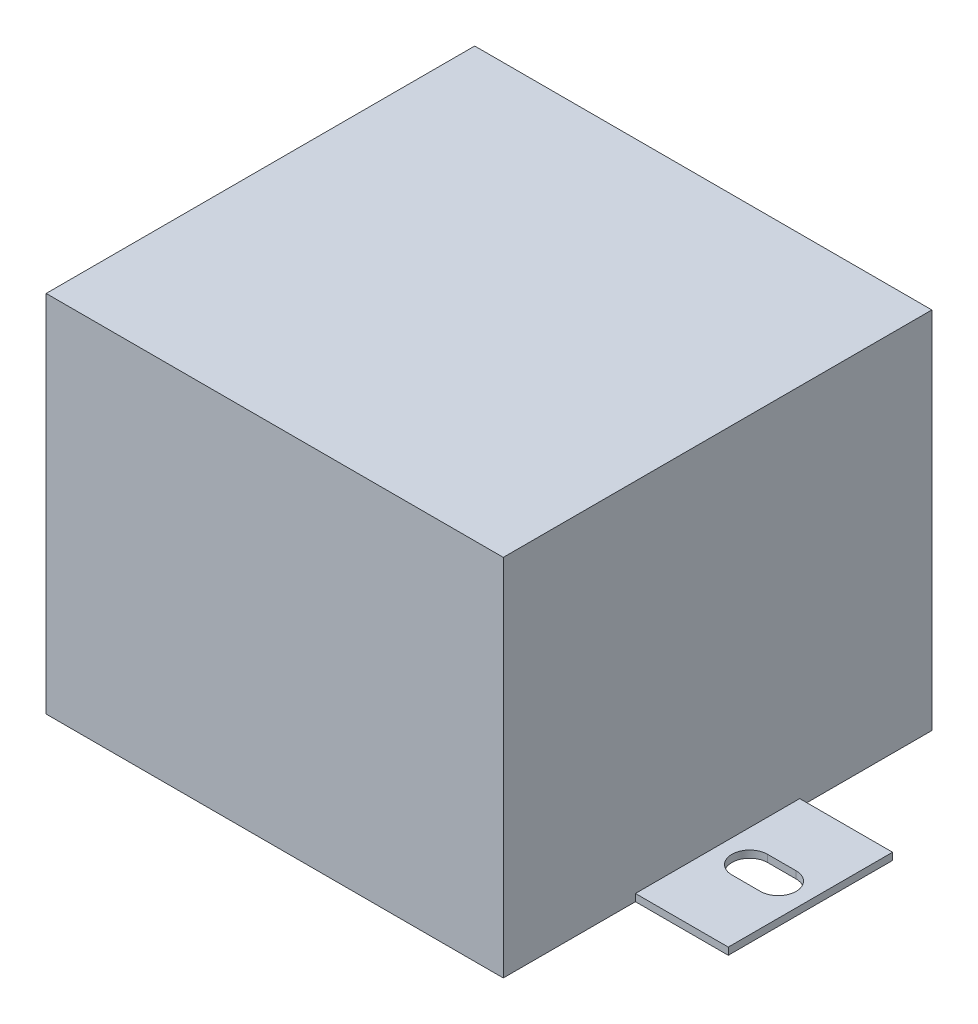
ISO-10303-21;
HEADER;
FILE_DESCRIPTION(('STEP AP214'),'2;1');
FILE_NAME('part.step','',(''),(''),'','','');
FILE_SCHEMA(('AUTOMOTIVE_DESIGN { 1 0 10303 214 1 1 1 1 }'));
ENDSEC;
DATA;
#1=APPLICATION_CONTEXT('core data for automotive mechanical design processes');
#2=APPLICATION_PROTOCOL_DEFINITION('international standard','automotive_design',2000,#1);
#3=PRODUCT_CONTEXT('',#1,'mechanical');
#4=PRODUCT('Part','Part','',(#3));
#5=PRODUCT_RELATED_PRODUCT_CATEGORY('part','',(#4));
#6=PRODUCT_DEFINITION_FORMATION('','',#4);
#7=PRODUCT_DEFINITION_CONTEXT('part definition',#1,'design');
#8=PRODUCT_DEFINITION('design','',#6,#7);
#9=PRODUCT_DEFINITION_SHAPE('','',#8);
#10=(LENGTH_UNIT() NAMED_UNIT(*) SI_UNIT(.MILLI.,.METRE.));
#11=(NAMED_UNIT(*) PLANE_ANGLE_UNIT() SI_UNIT($,.RADIAN.));
#12=(NAMED_UNIT(*) SI_UNIT($,.STERADIAN.) SOLID_ANGLE_UNIT());
#13=UNCERTAINTY_MEASURE_WITH_UNIT(LENGTH_MEASURE(1.E-05),#10,'distance_accuracy_value','');
#14=(GEOMETRIC_REPRESENTATION_CONTEXT(3) GLOBAL_UNCERTAINTY_ASSIGNED_CONTEXT((#13)) GLOBAL_UNIT_ASSIGNED_CONTEXT((#10,
#11,#12)) REPRESENTATION_CONTEXT('',''));
#15=CARTESIAN_POINT('',(0.,0.,0.));
#16=DIRECTION('',(0.,0.,1.));
#17=DIRECTION('',(1.,0.,0.));
#18=AXIS2_PLACEMENT_3D('',#15,#16,#17);
#19=CARTESIAN_POINT('',(0.,1.,0.));
#20=DIRECTION('',(0.,-1.,0.));
#21=DIRECTION('',(0.,0.,-1.));
#22=AXIS2_PLACEMENT_3D('',#19,#20,#21);
#23=PLANE('',#22);
#24=CARTESIAN_POINT('',(-36.5,1.,0.));
#25=DIRECTION('',(0.,1.,0.));
#26=DIRECTION('',(0.,0.,1.));
#27=AXIS2_PLACEMENT_3D('',#24,#25,#26);
#28=CIRCLE('',#27,2.5);
#29=CARTESIAN_POINT('',(-36.5,1.,2.5));
#30=VERTEX_POINT('',#29);
#31=CARTESIAN_POINT('',(-36.5,1.,-2.49999999999999));
#32=VERTEX_POINT('',#31);
#33=EDGE_CURVE('E258',#30,#32,#28,.T.);
#34=ORIENTED_EDGE('',*,*,#33,.F.);
#35=DIRECTION('',(1.,0.,0.));
#36=VECTOR('',#35,1.);
#37=CARTESIAN_POINT('',(-40.5,1.,2.5));
#38=LINE('',#37,#36);
#39=CARTESIAN_POINT('',(-40.5,1.,2.5));
#40=VERTEX_POINT('',#39);
#41=EDGE_CURVE('E269',#40,#30,#38,.T.);
#42=ORIENTED_EDGE('',*,*,#41,.F.);
#43=CARTESIAN_POINT('',(-40.5,1.,0.));
#44=DIRECTION('',(0.,1.,0.));
#45=DIRECTION('',(0.,0.,-1.));
#46=AXIS2_PLACEMENT_3D('',#43,#44,#45);
#47=CIRCLE('',#46,2.5);
#48=CARTESIAN_POINT('',(-40.5,1.,-2.49999999999999));
#49=VERTEX_POINT('',#48);
#50=EDGE_CURVE('E265',#49,#40,#47,.T.);
#51=ORIENTED_EDGE('',*,*,#50,.F.);
#52=DIRECTION('',(-1.,0.,0.));
#53=VECTOR('',#52,1.);
#54=CARTESIAN_POINT('',(-40.5,1.,-2.49999999999999));
#55=LINE('',#54,#53);
#56=EDGE_CURVE('E261',#32,#49,#55,.T.);
#57=ORIENTED_EDGE('',*,*,#56,.F.);
#58=EDGE_LOOP('',(#34,#42,#51,#57));
#59=FACE_BOUND('',#58,.T.);
#60=DIRECTION('',(0.,0.,1.));
#61=VECTOR('',#60,1.);
#62=CARTESIAN_POINT('',(-32.,1.,-30.));
#63=LINE('',#62,#61);
#64=CARTESIAN_POINT('',(-32.,1.,-11.5));
#65=VERTEX_POINT('',#64);
#66=CARTESIAN_POINT('',(-32.,1.,11.5));
#67=VERTEX_POINT('',#66);
#68=EDGE_CURVE('E11',#65,#67,#63,.T.);
#69=ORIENTED_EDGE('',*,*,#68,.F.);
#70=DIRECTION('',(-1.,0.,0.));
#71=VECTOR('',#70,1.);
#72=CARTESIAN_POINT('',(-32.,1.,-11.5));
#73=LINE('',#72,#71);
#74=CARTESIAN_POINT('',(-45.,1.,-11.5));
#75=VERTEX_POINT('',#74);
#76=EDGE_CURVE('E301',#65,#75,#73,.T.);
#77=ORIENTED_EDGE('',*,*,#76,.T.);
#78=DIRECTION('',(0.,0.,1.));
#79=VECTOR('',#78,1.);
#80=CARTESIAN_POINT('',(-45.,1.,-11.5));
#81=LINE('',#80,#79);
#82=CARTESIAN_POINT('',(-45.,1.,11.5));
#83=VERTEX_POINT('',#82);
#84=EDGE_CURVE('E304',#75,#83,#81,.T.);
#85=ORIENTED_EDGE('',*,*,#84,.T.);
#86=DIRECTION('',(1.,0.,0.));
#87=VECTOR('',#86,1.);
#88=CARTESIAN_POINT('',(-45.,1.,11.5));
#89=LINE('',#88,#87);
#90=EDGE_CURVE('E308',#83,#67,#89,.T.);
#91=ORIENTED_EDGE('',*,*,#90,.T.);
#92=EDGE_LOOP('',(#69,#77,#85,#91));
#93=FACE_BOUND('',#92,.T.);
#94=ADVANCED_FACE('F39',(#59,#93),#23,.F.);
#95=CARTESIAN_POINT('',(40.5,1.,0.));
#96=DIRECTION('',(0.,1.,0.));
#97=DIRECTION('',(0.,0.,1.));
#98=AXIS2_PLACEMENT_3D('',#95,#96,#97);
#99=CIRCLE('',#98,2.49999999999999);
#100=CARTESIAN_POINT('',(40.5,1.,2.49999999999997));
#101=VERTEX_POINT('',#100);
#102=CARTESIAN_POINT('',(40.5,1.,-2.50000000000001));
#103=VERTEX_POINT('',#102);
#104=EDGE_CURVE('E220',#101,#103,#99,.T.);
#105=ORIENTED_EDGE('',*,*,#104,.F.);
#106=DIRECTION('',(1.,0.,0.));
#107=VECTOR('',#106,1.);
#108=CARTESIAN_POINT('',(40.5,1.,2.49999999999997));
#109=LINE('',#108,#107);
#110=CARTESIAN_POINT('',(36.5,1.,2.49999999999997));
#111=VERTEX_POINT('',#110);
#112=EDGE_CURVE('E230',#111,#101,#109,.T.);
#113=ORIENTED_EDGE('',*,*,#112,.F.);
#114=CARTESIAN_POINT('',(36.5,1.,0.));
#115=DIRECTION('',(0.,1.,0.));
#116=DIRECTION('',(0.,0.,-1.));
#117=AXIS2_PLACEMENT_3D('',#114,#115,#116);
#118=CIRCLE('',#117,2.49999999999999);
#119=CARTESIAN_POINT('',(36.5,1.,-2.5));
#120=VERTEX_POINT('',#119);
#121=EDGE_CURVE('E227',#120,#111,#118,.T.);
#122=ORIENTED_EDGE('',*,*,#121,.F.);
#123=DIRECTION('',(-1.,0.,0.));
#124=VECTOR('',#123,1.);
#125=CARTESIAN_POINT('',(40.5,1.,-2.50000000000001));
#126=LINE('',#125,#124);
#127=EDGE_CURVE('E223',#103,#120,#126,.T.);
#128=ORIENTED_EDGE('',*,*,#127,.F.);
#129=EDGE_LOOP('',(#105,#113,#122,#128));
#130=FACE_BOUND('',#129,.T.);
#131=DIRECTION('',(0.,0.,-1.));
#132=VECTOR('',#131,1.);
#133=CARTESIAN_POINT('',(32.,1.,-30.));
#134=LINE('',#133,#132);
#135=CARTESIAN_POINT('',(32.,1.,11.5));
#136=VERTEX_POINT('',#135);
#137=CARTESIAN_POINT('',(32.,1.,-11.5));
#138=VERTEX_POINT('',#137);
#139=EDGE_CURVE('E49',#136,#138,#134,.T.);
#140=ORIENTED_EDGE('',*,*,#139,.F.);
#141=DIRECTION('',(1.,0.,0.));
#142=VECTOR('',#141,1.);
#143=CARTESIAN_POINT('',(32.,1.,11.5));
#144=LINE('',#143,#142);
#145=CARTESIAN_POINT('',(45.,1.,11.5));
#146=VERTEX_POINT('',#145);
#147=EDGE_CURVE('E311',#136,#146,#144,.T.);
#148=ORIENTED_EDGE('',*,*,#147,.T.);
#149=DIRECTION('',(0.,0.,-1.));
#150=VECTOR('',#149,1.);
#151=CARTESIAN_POINT('',(45.,1.,11.5));
#152=LINE('',#151,#150);
#153=CARTESIAN_POINT('',(45.,1.,-11.5));
#154=VERTEX_POINT('',#153);
#155=EDGE_CURVE('E314',#146,#154,#152,.T.);
#156=ORIENTED_EDGE('',*,*,#155,.T.);
#157=DIRECTION('',(-1.,0.,0.));
#158=VECTOR('',#157,1.);
#159=CARTESIAN_POINT('',(45.,1.,-11.5));
#160=LINE('',#159,#158);
#161=EDGE_CURVE('E317',#154,#138,#160,.T.);
#162=ORIENTED_EDGE('',*,*,#161,.T.);
#163=EDGE_LOOP('',(#140,#148,#156,#162));
#164=FACE_BOUND('',#163,.T.);
#165=ADVANCED_FACE('F431',(#130,#164),#23,.F.);
#166=CARTESIAN_POINT('',(0.,0.,0.));
#167=DIRECTION('',(0.,-1.,0.));
#168=DIRECTION('',(0.,0.,-1.));
#169=AXIS2_PLACEMENT_3D('',#166,#167,#168);
#170=PLANE('',#169);
#171=DIRECTION('',(0.,0.,1.));
#172=VECTOR('',#171,1.);
#173=CARTESIAN_POINT('',(-32.,0.,-30.));
#174=LINE('',#173,#172);
#175=CARTESIAN_POINT('',(-32.,0.,-30.));
#176=VERTEX_POINT('',#175);
#177=CARTESIAN_POINT('',(-32.,0.,-11.5));
#178=VERTEX_POINT('',#177);
#179=EDGE_CURVE('E300',#176,#178,#174,.T.);
#180=ORIENTED_EDGE('',*,*,#179,.F.);
#181=DIRECTION('',(-1.,0.,0.));
#182=VECTOR('',#181,1.);
#183=CARTESIAN_POINT('',(32.,0.,-30.));
#184=LINE('',#183,#182);
#185=CARTESIAN_POINT('',(32.,0.,-30.));
#186=VERTEX_POINT('',#185);
#187=EDGE_CURVE('E305',#186,#176,#184,.T.);
#188=ORIENTED_EDGE('',*,*,#187,.F.);
#189=DIRECTION('',(0.,0.,-1.));
#190=VECTOR('',#189,1.);
#191=CARTESIAN_POINT('',(32.,0.,-11.5));
#192=LINE('',#191,#190);
#193=CARTESIAN_POINT('',(32.,0.,-11.5));
#194=VERTEX_POINT('',#193);
#195=EDGE_CURVE('E350',#194,#186,#192,.T.);
#196=ORIENTED_EDGE('',*,*,#195,.F.);
#197=DIRECTION('',(-1.,0.,0.));
#198=VECTOR('',#197,1.);
#199=CARTESIAN_POINT('',(45.,0.,-11.5));
#200=LINE('',#199,#198);
#201=CARTESIAN_POINT('',(45.,0.,-11.5));
#202=VERTEX_POINT('',#201);
#203=EDGE_CURVE('E347',#202,#194,#200,.T.);
#204=ORIENTED_EDGE('',*,*,#203,.F.);
#205=DIRECTION('',(0.,0.,-1.));
#206=VECTOR('',#205,1.);
#207=CARTESIAN_POINT('',(45.,0.,11.5));
#208=LINE('',#207,#206);
#209=CARTESIAN_POINT('',(45.,0.,11.5));
#210=VERTEX_POINT('',#209);
#211=EDGE_CURVE('E344',#210,#202,#208,.T.);
#212=ORIENTED_EDGE('',*,*,#211,.F.);
#213=DIRECTION('',(1.,0.,0.));
#214=VECTOR('',#213,1.);
#215=CARTESIAN_POINT('',(32.,0.,11.5));
#216=LINE('',#215,#214);
#217=CARTESIAN_POINT('',(32.,0.,11.5));
#218=VERTEX_POINT('',#217);
#219=EDGE_CURVE('E341',#218,#210,#216,.T.);
#220=ORIENTED_EDGE('',*,*,#219,.F.);
#221=DIRECTION('',(0.,0.,-1.));
#222=VECTOR('',#221,1.);
#223=CARTESIAN_POINT('',(32.,0.,30.));
#224=LINE('',#223,#222);
#225=CARTESIAN_POINT('',(32.,0.,30.));
#226=VERTEX_POINT('',#225);
#227=EDGE_CURVE('E338',#226,#218,#224,.T.);
#228=ORIENTED_EDGE('',*,*,#227,.F.);
#229=DIRECTION('',(1.,0.,0.));
#230=VECTOR('',#229,1.);
#231=CARTESIAN_POINT('',(-32.,0.,30.));
#232=LINE('',#231,#230);
#233=CARTESIAN_POINT('',(-32.,0.,30.));
#234=VERTEX_POINT('',#233);
#235=EDGE_CURVE('E335',#234,#226,#232,.T.);
#236=ORIENTED_EDGE('',*,*,#235,.F.);
#237=DIRECTION('',(0.,0.,1.));
#238=VECTOR('',#237,1.);
#239=CARTESIAN_POINT('',(-32.,0.,11.5));
#240=LINE('',#239,#238);
#241=CARTESIAN_POINT('',(-32.,0.,11.5));
#242=VERTEX_POINT('',#241);
#243=EDGE_CURVE('E189',#242,#234,#240,.T.);
#244=ORIENTED_EDGE('',*,*,#243,.F.);
#245=DIRECTION('',(1.,0.,0.));
#246=VECTOR('',#245,1.);
#247=CARTESIAN_POINT('',(-45.,0.,11.5));
#248=LINE('',#247,#246);
#249=CARTESIAN_POINT('',(-45.,0.,11.5));
#250=VERTEX_POINT('',#249);
#251=EDGE_CURVE('E330',#250,#242,#248,.T.);
#252=ORIENTED_EDGE('',*,*,#251,.F.);
#253=DIRECTION('',(0.,0.,1.));
#254=VECTOR('',#253,1.);
#255=CARTESIAN_POINT('',(-45.,0.,-11.5));
#256=LINE('',#255,#254);
#257=CARTESIAN_POINT('',(-45.,0.,-11.5));
#258=VERTEX_POINT('',#257);
#259=EDGE_CURVE('E327',#258,#250,#256,.T.);
#260=ORIENTED_EDGE('',*,*,#259,.F.);
#261=DIRECTION('',(-1.,0.,0.));
#262=VECTOR('',#261,1.);
#263=CARTESIAN_POINT('',(-32.,0.,-11.5));
#264=LINE('',#263,#262);
#265=EDGE_CURVE('E324',#178,#258,#264,.T.);
#266=ORIENTED_EDGE('',*,*,#265,.F.);
#267=EDGE_LOOP('',(#180,#188,#196,#204,#212,#220,#228,#236,#244,#252,#260,#266));
#268=FACE_BOUND('',#267,.T.);
#269=DIRECTION('',(1.,0.,0.));
#270=VECTOR('',#269,1.);
#271=CARTESIAN_POINT('',(-40.5,0.,2.5));
#272=LINE('',#271,#270);
#273=CARTESIAN_POINT('',(-40.5,0.,2.5));
#274=VERTEX_POINT('',#273);
#275=CARTESIAN_POINT('',(-36.5,0.,2.5));
#276=VERTEX_POINT('',#275);
#277=EDGE_CURVE('E262',#274,#276,#272,.T.);
#278=ORIENTED_EDGE('',*,*,#277,.T.);
#279=CARTESIAN_POINT('',(-36.5,0.,0.));
#280=DIRECTION('',(0.,1.,0.));
#281=DIRECTION('',(0.,0.,1.));
#282=AXIS2_PLACEMENT_3D('',#279,#280,#281);
#283=CIRCLE('',#282,2.5);
#284=CARTESIAN_POINT('',(-36.5,0.,-2.49999999999999));
#285=VERTEX_POINT('',#284);
#286=EDGE_CURVE('E257',#276,#285,#283,.T.);
#287=ORIENTED_EDGE('',*,*,#286,.T.);
#288=DIRECTION('',(-1.,0.,0.));
#289=VECTOR('',#288,1.);
#290=CARTESIAN_POINT('',(-40.5,0.,-2.49999999999999));
#291=LINE('',#290,#289);
#292=CARTESIAN_POINT('',(-40.5,0.,-2.49999999999999));
#293=VERTEX_POINT('',#292);
#294=EDGE_CURVE('E276',#285,#293,#291,.T.);
#295=ORIENTED_EDGE('',*,*,#294,.T.);
#296=CARTESIAN_POINT('',(-40.5,0.,0.));
#297=DIRECTION('',(0.,1.,0.));
#298=DIRECTION('',(0.,0.,-1.));
#299=AXIS2_PLACEMENT_3D('',#296,#297,#298);
#300=CIRCLE('',#299,2.5);
#301=EDGE_CURVE('E280',#293,#274,#300,.T.);
#302=ORIENTED_EDGE('',*,*,#301,.T.);
#303=EDGE_LOOP('',(#278,#287,#295,#302));
#304=FACE_BOUND('',#303,.T.);
#305=DIRECTION('',(1.,0.,0.));
#306=VECTOR('',#305,1.);
#307=CARTESIAN_POINT('',(40.5,0.,2.49999999999997));
#308=LINE('',#307,#306);
#309=CARTESIAN_POINT('',(36.5,0.,2.49999999999997));
#310=VERTEX_POINT('',#309);
#311=CARTESIAN_POINT('',(40.5,0.,2.49999999999997));
#312=VERTEX_POINT('',#311);
#313=EDGE_CURVE('E224',#310,#312,#308,.T.);
#314=ORIENTED_EDGE('',*,*,#313,.T.);
#315=CARTESIAN_POINT('',(40.5,0.,0.));
#316=DIRECTION('',(0.,1.,0.));
#317=DIRECTION('',(0.,0.,1.));
#318=AXIS2_PLACEMENT_3D('',#315,#316,#317);
#319=CIRCLE('',#318,2.49999999999999);
#320=CARTESIAN_POINT('',(40.5,0.,-2.50000000000001));
#321=VERTEX_POINT('',#320);
#322=EDGE_CURVE('E65',#312,#321,#319,.T.);
#323=ORIENTED_EDGE('',*,*,#322,.T.);
#324=DIRECTION('',(-1.,0.,0.));
#325=VECTOR('',#324,1.);
#326=CARTESIAN_POINT('',(40.5,0.,-2.50000000000001));
#327=LINE('',#326,#325);
#328=CARTESIAN_POINT('',(36.5,0.,-2.5));
#329=VERTEX_POINT('',#328);
#330=EDGE_CURVE('E236',#321,#329,#327,.T.);
#331=ORIENTED_EDGE('',*,*,#330,.T.);
#332=CARTESIAN_POINT('',(36.5,0.,0.));
#333=DIRECTION('',(0.,1.,0.));
#334=DIRECTION('',(0.,0.,-1.));
#335=AXIS2_PLACEMENT_3D('',#332,#333,#334);
#336=CIRCLE('',#335,2.49999999999999);
#337=EDGE_CURVE('E240',#329,#310,#336,.T.);
#338=ORIENTED_EDGE('',*,*,#337,.T.);
#339=EDGE_LOOP('',(#314,#323,#331,#338));
#340=FACE_BOUND('',#339,.T.);
#341=ADVANCED_FACE('F399',(#268,#304,#340),#170,.T.);
#342=CARTESIAN_POINT('',(-32.,1.,-11.5));
#343=DIRECTION('',(0.,0.,1.));
#344=DIRECTION('',(1.,0.,0.));
#345=AXIS2_PLACEMENT_3D('',#342,#343,#344);
#346=PLANE('',#345);
#347=ORIENTED_EDGE('',*,*,#265,.T.);
#348=DIRECTION('',(0.,-1.,0.));
#349=VECTOR('',#348,1.);
#350=CARTESIAN_POINT('',(-45.,1.,-11.5));
#351=LINE('',#350,#349);
#352=EDGE_CURVE('E384',#75,#258,#351,.T.);
#353=ORIENTED_EDGE('',*,*,#352,.F.);
#354=ORIENTED_EDGE('',*,*,#76,.F.);
#355=DIRECTION('',(0.,-1.,0.));
#356=VECTOR('',#355,1.);
#357=CARTESIAN_POINT('',(-32.,1.,-11.5));
#358=LINE('',#357,#356);
#359=EDGE_CURVE('E43',#65,#178,#358,.T.);
#360=ORIENTED_EDGE('',*,*,#359,.T.);
#361=EDGE_LOOP('',(#347,#353,#354,#360));
#362=FACE_BOUND('',#361,.T.);
#363=ADVANCED_FACE('F41',(#362),#346,.F.);
#364=CARTESIAN_POINT('',(-45.,1.,-11.5));
#365=DIRECTION('',(1.,0.,0.));
#366=DIRECTION('',(0.,0.,-1.));
#367=AXIS2_PLACEMENT_3D('',#364,#365,#366);
#368=PLANE('',#367);
#369=ORIENTED_EDGE('',*,*,#259,.T.);
#370=DIRECTION('',(0.,-1.,0.));
#371=VECTOR('',#370,1.);
#372=CARTESIAN_POINT('',(-45.,1.,11.5));
#373=LINE('',#372,#371);
#374=EDGE_CURVE('E381',#83,#250,#373,.T.);
#375=ORIENTED_EDGE('',*,*,#374,.F.);
#376=ORIENTED_EDGE('',*,*,#84,.F.);
#377=ORIENTED_EDGE('',*,*,#352,.T.);
#378=EDGE_LOOP('',(#369,#375,#376,#377));
#379=FACE_BOUND('',#378,.T.);
#380=ADVANCED_FACE('F404',(#379),#368,.F.);
#381=CARTESIAN_POINT('',(-45.,1.,11.5));
#382=DIRECTION('',(0.,0.,-1.));
#383=DIRECTION('',(-1.,0.,0.));
#384=AXIS2_PLACEMENT_3D('',#381,#382,#383);
#385=PLANE('',#384);
#386=ORIENTED_EDGE('',*,*,#251,.T.);
#387=DIRECTION('',(0.,-1.,0.));
#388=VECTOR('',#387,1.);
#389=CARTESIAN_POINT('',(-32.,1.,11.5));
#390=LINE('',#389,#388);
#391=EDGE_CURVE('E193',#67,#242,#390,.T.);
#392=ORIENTED_EDGE('',*,*,#391,.F.);
#393=ORIENTED_EDGE('',*,*,#90,.F.);
#394=ORIENTED_EDGE('',*,*,#374,.T.);
#395=EDGE_LOOP('',(#386,#392,#393,#394));
#396=FACE_BOUND('',#395,.T.);
#397=ADVANCED_FACE('F407',(#396),#385,.F.);
#398=CARTESIAN_POINT('',(-32.,1.,11.5));
#399=DIRECTION('',(1.,0.,0.));
#400=DIRECTION('',(0.,0.,-1.));
#401=AXIS2_PLACEMENT_3D('',#398,#399,#400);
#402=PLANE('',#401);
#403=ORIENTED_EDGE('',*,*,#243,.T.);
#404=DIRECTION('',(0.,-1.,0.));
#405=VECTOR('',#404,1.);
#406=CARTESIAN_POINT('',(-32.,1.,30.));
#407=LINE('',#406,#405);
#408=CARTESIAN_POINT('',(-32.,51.,30.));
#409=VERTEX_POINT('',#408);
#410=EDGE_CURVE('E181',#409,#234,#407,.T.);
#411=ORIENTED_EDGE('',*,*,#410,.F.);
#412=DIRECTION('',(0.,0.,1.));
#413=VECTOR('',#412,1.);
#414=CARTESIAN_POINT('',(-32.,51.,-30.));
#415=LINE('',#414,#413);
#416=CARTESIAN_POINT('',(-32.,51.,-30.));
#417=VERTEX_POINT('',#416);
#418=EDGE_CURVE('E186',#417,#409,#415,.T.);
#419=ORIENTED_EDGE('',*,*,#418,.F.);
#420=DIRECTION('',(0.,-1.,0.));
#421=VECTOR('',#420,1.);
#422=CARTESIAN_POINT('',(-32.,1.,-30.));
#423=LINE('',#422,#421);
#424=EDGE_CURVE('E320',#417,#176,#423,.T.);
#425=ORIENTED_EDGE('',*,*,#424,.T.);
#426=ORIENTED_EDGE('',*,*,#179,.T.);
#427=ORIENTED_EDGE('',*,*,#359,.F.);
#428=ORIENTED_EDGE('',*,*,#68,.T.);
#429=ORIENTED_EDGE('',*,*,#391,.T.);
#430=EDGE_LOOP('',(#403,#411,#419,#425,#426,#427,#428,#429));
#431=FACE_BOUND('',#430,.T.);
#432=ADVANCED_FACE('F183',(#431),#402,.F.);
#433=CARTESIAN_POINT('',(-32.,1.,30.));
#434=DIRECTION('',(0.,0.,-1.));
#435=DIRECTION('',(-1.,0.,0.));
#436=AXIS2_PLACEMENT_3D('',#433,#434,#435);
#437=PLANE('',#436);
#438=ORIENTED_EDGE('',*,*,#235,.T.);
#439=DIRECTION('',(0.,-1.,0.));
#440=VECTOR('',#439,1.);
#441=CARTESIAN_POINT('',(32.,1.,30.));
#442=LINE('',#441,#440);
#443=CARTESIAN_POINT('',(32.,51.,30.));
#444=VERTEX_POINT('',#443);
#445=EDGE_CURVE('E194',#444,#226,#442,.T.);
#446=ORIENTED_EDGE('',*,*,#445,.F.);
#447=DIRECTION('',(1.,0.,0.));
#448=VECTOR('',#447,1.);
#449=CARTESIAN_POINT('',(-32.,51.,30.));
#450=LINE('',#449,#448);
#451=EDGE_CURVE('E197',#409,#444,#450,.T.);
#452=ORIENTED_EDGE('',*,*,#451,.F.);
#453=ORIENTED_EDGE('',*,*,#410,.T.);
#454=EDGE_LOOP('',(#438,#446,#452,#453));
#455=FACE_BOUND('',#454,.T.);
#456=ADVANCED_FACE('F198',(#455),#437,.F.);
#457=CARTESIAN_POINT('',(32.,1.,11.5));
#458=DIRECTION('',(0.,0.,-1.));
#459=DIRECTION('',(-1.,0.,0.));
#460=AXIS2_PLACEMENT_3D('',#457,#458,#459);
#461=PLANE('',#460);
#462=ORIENTED_EDGE('',*,*,#219,.T.);
#463=DIRECTION('',(0.,-1.,0.));
#464=VECTOR('',#463,1.);
#465=CARTESIAN_POINT('',(45.,1.,11.5));
#466=LINE('',#465,#464);
#467=EDGE_CURVE('E369',#146,#210,#466,.T.);
#468=ORIENTED_EDGE('',*,*,#467,.F.);
#469=ORIENTED_EDGE('',*,*,#147,.F.);
#470=DIRECTION('',(0.,-1.,0.));
#471=VECTOR('',#470,1.);
#472=CARTESIAN_POINT('',(32.,1.,11.5));
#473=LINE('',#472,#471);
#474=EDGE_CURVE('E373',#136,#218,#473,.T.);
#475=ORIENTED_EDGE('',*,*,#474,.T.);
#476=EDGE_LOOP('',(#462,#468,#469,#475));
#477=FACE_BOUND('',#476,.T.);
#478=ADVANCED_FACE('F456',(#477),#461,.F.);
#479=CARTESIAN_POINT('',(45.,1.,11.5));
#480=DIRECTION('',(-1.,0.,0.));
#481=DIRECTION('',(0.,0.,1.));
#482=AXIS2_PLACEMENT_3D('',#479,#480,#481);
#483=PLANE('',#482);
#484=ORIENTED_EDGE('',*,*,#211,.T.);
#485=DIRECTION('',(0.,-1.,0.));
#486=VECTOR('',#485,1.);
#487=CARTESIAN_POINT('',(45.,1.,-11.5));
#488=LINE('',#487,#486);
#489=EDGE_CURVE('E365',#154,#202,#488,.T.);
#490=ORIENTED_EDGE('',*,*,#489,.F.);
#491=ORIENTED_EDGE('',*,*,#155,.F.);
#492=ORIENTED_EDGE('',*,*,#467,.T.);
#493=EDGE_LOOP('',(#484,#490,#491,#492));
#494=FACE_BOUND('',#493,.T.);
#495=ADVANCED_FACE('F459',(#494),#483,.F.);
#496=CARTESIAN_POINT('',(45.,1.,-11.5));
#497=DIRECTION('',(0.,0.,1.));
#498=DIRECTION('',(1.,0.,0.));
#499=AXIS2_PLACEMENT_3D('',#496,#497,#498);
#500=PLANE('',#499);
#501=ORIENTED_EDGE('',*,*,#203,.T.);
#502=DIRECTION('',(0.,-1.,0.));
#503=VECTOR('',#502,1.);
#504=CARTESIAN_POINT('',(32.,1.,-11.5));
#505=LINE('',#504,#503);
#506=EDGE_CURVE('E361',#138,#194,#505,.T.);
#507=ORIENTED_EDGE('',*,*,#506,.F.);
#508=ORIENTED_EDGE('',*,*,#161,.F.);
#509=ORIENTED_EDGE('',*,*,#489,.T.);
#510=EDGE_LOOP('',(#501,#507,#508,#509));
#511=FACE_BOUND('',#510,.T.);
#512=ADVANCED_FACE('F427',(#511),#500,.F.);
#513=CARTESIAN_POINT('',(32.,1.,-11.5));
#514=DIRECTION('',(-1.,0.,0.));
#515=DIRECTION('',(0.,0.,1.));
#516=AXIS2_PLACEMENT_3D('',#513,#514,#515);
#517=PLANE('',#516);
#518=ORIENTED_EDGE('',*,*,#195,.T.);
#519=DIRECTION('',(0.,-1.,0.));
#520=VECTOR('',#519,1.);
#521=CARTESIAN_POINT('',(32.,1.,-30.));
#522=LINE('',#521,#520);
#523=CARTESIAN_POINT('',(32.,51.,-30.));
#524=VERTEX_POINT('',#523);
#525=EDGE_CURVE('E357',#524,#186,#522,.T.);
#526=ORIENTED_EDGE('',*,*,#525,.F.);
#527=DIRECTION('',(0.,0.,-1.));
#528=VECTOR('',#527,1.);
#529=CARTESIAN_POINT('',(32.,51.,-30.));
#530=LINE('',#529,#528);
#531=EDGE_CURVE('E204',#444,#524,#530,.T.);
#532=ORIENTED_EDGE('',*,*,#531,.F.);
#533=ORIENTED_EDGE('',*,*,#445,.T.);
#534=ORIENTED_EDGE('',*,*,#227,.T.);
#535=ORIENTED_EDGE('',*,*,#474,.F.);
#536=ORIENTED_EDGE('',*,*,#139,.T.);
#537=ORIENTED_EDGE('',*,*,#506,.T.);
#538=EDGE_LOOP('',(#518,#526,#532,#533,#534,#535,#536,#537));
#539=FACE_BOUND('',#538,.T.);
#540=ADVANCED_FACE('F413',(#539),#517,.F.);
#541=CARTESIAN_POINT('',(32.,1.,-30.));
#542=DIRECTION('',(0.,0.,1.));
#543=DIRECTION('',(1.,0.,0.));
#544=AXIS2_PLACEMENT_3D('',#541,#542,#543);
#545=PLANE('',#544);
#546=ORIENTED_EDGE('',*,*,#187,.T.);
#547=ORIENTED_EDGE('',*,*,#424,.F.);
#548=DIRECTION('',(-1.,0.,0.));
#549=VECTOR('',#548,1.);
#550=CARTESIAN_POINT('',(-32.,51.,-30.));
#551=LINE('',#550,#549);
#552=EDGE_CURVE('E209',#524,#417,#551,.T.);
#553=ORIENTED_EDGE('',*,*,#552,.F.);
#554=ORIENTED_EDGE('',*,*,#525,.T.);
#555=EDGE_LOOP('',(#546,#547,#553,#554));
#556=FACE_BOUND('',#555,.T.);
#557=ADVANCED_FACE('F416',(#556),#545,.F.);
#558=CARTESIAN_POINT('',(-36.5,1.,0.));
#559=DIRECTION('',(0.,-1.,0.));
#560=DIRECTION('',(0.,0.,-1.));
#561=AXIS2_PLACEMENT_3D('',#558,#559,#560);
#562=CYLINDRICAL_SURFACE('',#561,2.5);
#563=ORIENTED_EDGE('',*,*,#286,.F.);
#564=DIRECTION('',(0.,-1.,0.));
#565=VECTOR('',#564,1.);
#566=CARTESIAN_POINT('',(-36.5,1.,2.5));
#567=LINE('',#566,#565);
#568=EDGE_CURVE('E272',#30,#276,#567,.T.);
#569=ORIENTED_EDGE('',*,*,#568,.F.);
#570=ORIENTED_EDGE('',*,*,#33,.T.);
#571=DIRECTION('',(0.,-1.,0.));
#572=VECTOR('',#571,1.);
#573=CARTESIAN_POINT('',(-36.5,1.,-2.49999999999999));
#574=LINE('',#573,#572);
#575=EDGE_CURVE('E296',#32,#285,#574,.T.);
#576=ORIENTED_EDGE('',*,*,#575,.T.);
#577=EDGE_LOOP('',(#563,#569,#570,#576));
#578=FACE_BOUND('',#577,.T.);
#579=ADVANCED_FACE('F418',(#578),#562,.F.);
#580=CARTESIAN_POINT('',(-40.5,1.,-2.49999999999999));
#581=DIRECTION('',(0.,0.,1.));
#582=DIRECTION('',(1.,0.,0.));
#583=AXIS2_PLACEMENT_3D('',#580,#581,#582);
#584=PLANE('',#583);
#585=ORIENTED_EDGE('',*,*,#294,.F.);
#586=ORIENTED_EDGE('',*,*,#575,.F.);
#587=ORIENTED_EDGE('',*,*,#56,.T.);
#588=DIRECTION('',(0.,-1.,0.));
#589=VECTOR('',#588,1.);
#590=CARTESIAN_POINT('',(-40.5,1.,-2.49999999999999));
#591=LINE('',#590,#589);
#592=EDGE_CURVE('E293',#49,#293,#591,.T.);
#593=ORIENTED_EDGE('',*,*,#592,.T.);
#594=EDGE_LOOP('',(#585,#586,#587,#593));
#595=FACE_BOUND('',#594,.T.);
#596=ADVANCED_FACE('F424',(#595),#584,.T.);
#597=CARTESIAN_POINT('',(-40.5,1.,0.));
#598=DIRECTION('',(0.,-1.,0.));
#599=DIRECTION('',(0.,0.,-1.));
#600=AXIS2_PLACEMENT_3D('',#597,#598,#599);
#601=CYLINDRICAL_SURFACE('',#600,2.5);
#602=ORIENTED_EDGE('',*,*,#301,.F.);
#603=ORIENTED_EDGE('',*,*,#592,.F.);
#604=ORIENTED_EDGE('',*,*,#50,.T.);
#605=DIRECTION('',(0.,-1.,0.));
#606=VECTOR('',#605,1.);
#607=CARTESIAN_POINT('',(-40.5,1.,2.5));
#608=LINE('',#607,#606);
#609=EDGE_CURVE('E290',#40,#274,#608,.T.);
#610=ORIENTED_EDGE('',*,*,#609,.T.);
#611=EDGE_LOOP('',(#602,#603,#604,#610));
#612=FACE_BOUND('',#611,.T.);
#613=ADVANCED_FACE('F538',(#612),#601,.F.);
#614=CARTESIAN_POINT('',(-40.5,1.,2.5));
#615=DIRECTION('',(0.,0.,-1.));
#616=DIRECTION('',(-1.,0.,0.));
#617=AXIS2_PLACEMENT_3D('',#614,#615,#616);
#618=PLANE('',#617);
#619=ORIENTED_EDGE('',*,*,#277,.F.);
#620=ORIENTED_EDGE('',*,*,#609,.F.);
#621=ORIENTED_EDGE('',*,*,#41,.T.);
#622=ORIENTED_EDGE('',*,*,#568,.T.);
#623=EDGE_LOOP('',(#619,#620,#621,#622));
#624=FACE_BOUND('',#623,.T.);
#625=ADVANCED_FACE('F531',(#624),#618,.T.);
#626=CARTESIAN_POINT('',(40.5,1.,0.));
#627=DIRECTION('',(0.,-1.,0.));
#628=DIRECTION('',(0.,0.,-1.));
#629=AXIS2_PLACEMENT_3D('',#626,#627,#628);
#630=CYLINDRICAL_SURFACE('',#629,2.49999999999999);
#631=ORIENTED_EDGE('',*,*,#322,.F.);
#632=DIRECTION('',(0.,-1.,0.));
#633=VECTOR('',#632,1.);
#634=CARTESIAN_POINT('',(40.5,1.,2.49999999999997));
#635=LINE('',#634,#633);
#636=EDGE_CURVE('E233',#101,#312,#635,.T.);
#637=ORIENTED_EDGE('',*,*,#636,.F.);
#638=ORIENTED_EDGE('',*,*,#104,.T.);
#639=DIRECTION('',(0.,-1.,0.));
#640=VECTOR('',#639,1.);
#641=CARTESIAN_POINT('',(40.5,1.,-2.50000000000001));
#642=LINE('',#641,#640);
#643=EDGE_CURVE('E254',#103,#321,#642,.T.);
#644=ORIENTED_EDGE('',*,*,#643,.T.);
#645=EDGE_LOOP('',(#631,#637,#638,#644));
#646=FACE_BOUND('',#645,.T.);
#647=ADVANCED_FACE('F523',(#646),#630,.F.);
#648=CARTESIAN_POINT('',(40.5,1.,-2.50000000000001));
#649=DIRECTION('',(0.,0.,1.));
#650=DIRECTION('',(1.,0.,0.));
#651=AXIS2_PLACEMENT_3D('',#648,#649,#650);
#652=PLANE('',#651);
#653=ORIENTED_EDGE('',*,*,#330,.F.);
#654=ORIENTED_EDGE('',*,*,#643,.F.);
#655=ORIENTED_EDGE('',*,*,#127,.T.);
#656=DIRECTION('',(0.,-1.,0.));
#657=VECTOR('',#656,1.);
#658=CARTESIAN_POINT('',(36.5,1.,-2.5));
#659=LINE('',#658,#657);
#660=EDGE_CURVE('E251',#120,#329,#659,.T.);
#661=ORIENTED_EDGE('',*,*,#660,.T.);
#662=EDGE_LOOP('',(#653,#654,#655,#661));
#663=FACE_BOUND('',#662,.T.);
#664=ADVANCED_FACE('F515',(#663),#652,.T.);
#665=CARTESIAN_POINT('',(36.5,1.,0.));
#666=DIRECTION('',(0.,-1.,0.));
#667=DIRECTION('',(0.,0.,-1.));
#668=AXIS2_PLACEMENT_3D('',#665,#666,#667);
#669=CYLINDRICAL_SURFACE('',#668,2.49999999999999);
#670=ORIENTED_EDGE('',*,*,#337,.F.);
#671=ORIENTED_EDGE('',*,*,#660,.F.);
#672=ORIENTED_EDGE('',*,*,#121,.T.);
#673=DIRECTION('',(0.,-1.,0.));
#674=VECTOR('',#673,1.);
#675=CARTESIAN_POINT('',(36.5,1.,2.49999999999997));
#676=LINE('',#675,#674);
#677=EDGE_CURVE('E57',#111,#310,#676,.T.);
#678=ORIENTED_EDGE('',*,*,#677,.T.);
#679=EDGE_LOOP('',(#670,#671,#672,#678));
#680=FACE_BOUND('',#679,.T.);
#681=ADVANCED_FACE('F508',(#680),#669,.F.);
#682=CARTESIAN_POINT('',(40.5,1.,2.49999999999997));
#683=DIRECTION('',(0.,0.,-1.));
#684=DIRECTION('',(-1.,0.,0.));
#685=AXIS2_PLACEMENT_3D('',#682,#683,#684);
#686=PLANE('',#685);
#687=ORIENTED_EDGE('',*,*,#313,.F.);
#688=ORIENTED_EDGE('',*,*,#677,.F.);
#689=ORIENTED_EDGE('',*,*,#112,.T.);
#690=ORIENTED_EDGE('',*,*,#636,.T.);
#691=EDGE_LOOP('',(#687,#688,#689,#690));
#692=FACE_BOUND('',#691,.T.);
#693=ADVANCED_FACE('F499',(#692),#686,.T.);
#694=CARTESIAN_POINT('',(0.,51.,0.));
#695=DIRECTION('',(0.,1.,0.));
#696=DIRECTION('',(0.,0.,1.));
#697=AXIS2_PLACEMENT_3D('',#694,#695,#696);
#698=PLANE('',#697);
#699=ORIENTED_EDGE('',*,*,#418,.T.);
#700=ORIENTED_EDGE('',*,*,#451,.T.);
#701=ORIENTED_EDGE('',*,*,#531,.T.);
#702=ORIENTED_EDGE('',*,*,#552,.T.);
#703=EDGE_LOOP('',(#699,#700,#701,#702));
#704=FACE_BOUND('',#703,.T.);
#705=ADVANCED_FACE('F207',(#704),#698,.T.);
#706=CLOSED_SHELL('',(#94,#165,#341,#363,#380,#397,#432,#456,#478,#495,#512,#540,#557,#579,#596,
#613,#625,#647,#664,#681,#693,#705));
#707=MANIFOLD_SOLID_BREP('B2',#706);
#708=ADVANCED_BREP_SHAPE_REPRESENTATION('',(#18,#707),#14);
#709=SHAPE_DEFINITION_REPRESENTATION(#9,#708);
ENDSEC;
END-ISO-10303-21;
